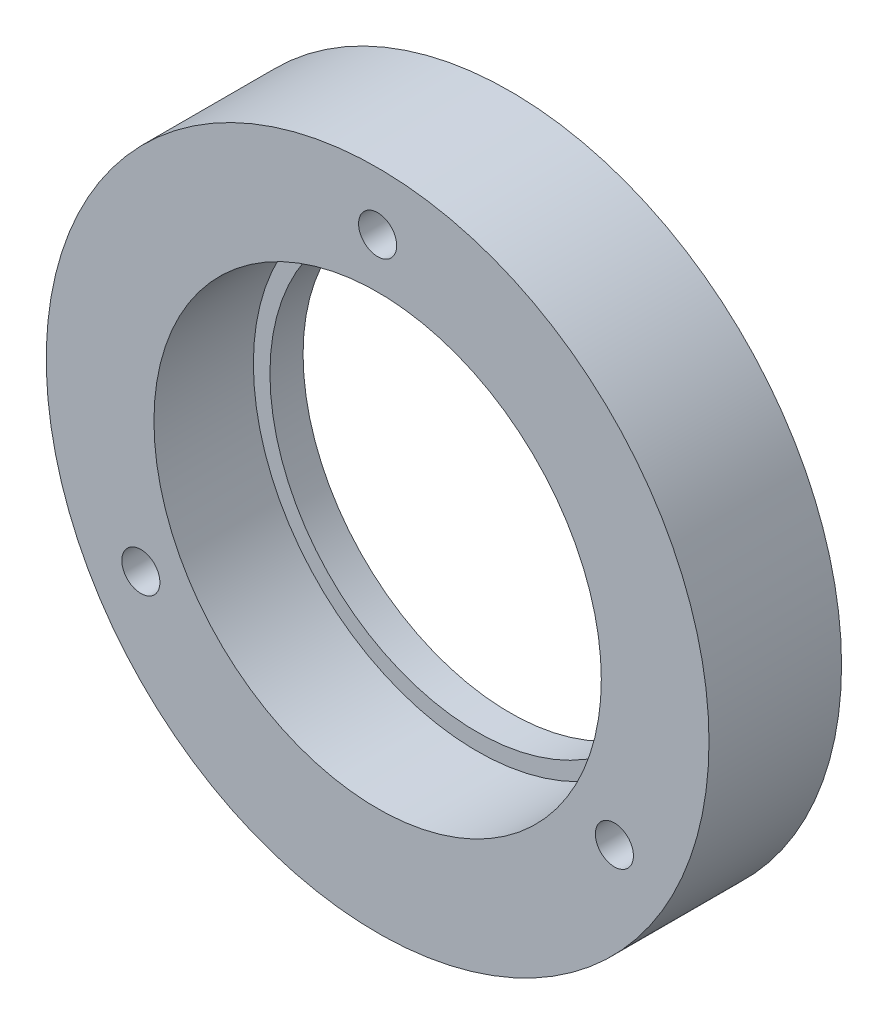
ISO-10303-21;
HEADER;
FILE_DESCRIPTION(('STEP AP214'),'2;1');
FILE_NAME('part.step','',(''),(''),'','','');
FILE_SCHEMA(('AUTOMOTIVE_DESIGN { 1 0 10303 214 1 1 1 1 }'));
ENDSEC;
DATA;
#1=APPLICATION_CONTEXT('core data for automotive mechanical design processes');
#2=APPLICATION_PROTOCOL_DEFINITION('international standard','automotive_design',2000,#1);
#3=PRODUCT_CONTEXT('',#1,'mechanical');
#4=PRODUCT('Part','Part','',(#3));
#5=PRODUCT_RELATED_PRODUCT_CATEGORY('part','',(#4));
#6=PRODUCT_DEFINITION_FORMATION('','',#4);
#7=PRODUCT_DEFINITION_CONTEXT('part definition',#1,'design');
#8=PRODUCT_DEFINITION('design','',#6,#7);
#9=PRODUCT_DEFINITION_SHAPE('','',#8);
#10=(LENGTH_UNIT() NAMED_UNIT(*) SI_UNIT(.MILLI.,.METRE.));
#11=(NAMED_UNIT(*) PLANE_ANGLE_UNIT() SI_UNIT($,.RADIAN.));
#12=(NAMED_UNIT(*) SI_UNIT($,.STERADIAN.) SOLID_ANGLE_UNIT());
#13=UNCERTAINTY_MEASURE_WITH_UNIT(LENGTH_MEASURE(1.E-05),#10,'distance_accuracy_value','');
#14=(GEOMETRIC_REPRESENTATION_CONTEXT(3) GLOBAL_UNCERTAINTY_ASSIGNED_CONTEXT((#13)) GLOBAL_UNIT_ASSIGNED_CONTEXT((#10,
#11,#12)) REPRESENTATION_CONTEXT('',''));
#15=CARTESIAN_POINT('',(0.,0.,0.));
#16=DIRECTION('',(0.,0.,1.));
#17=DIRECTION('',(1.,0.,0.));
#18=AXIS2_PLACEMENT_3D('',#15,#16,#17);
#19=CARTESIAN_POINT('',(14.2894191624433,-8.24999999999986,8.));
#20=DIRECTION('',(0.,0.,-1.));
#21=DIRECTION('',(-1.,0.,0.));
#22=AXIS2_PLACEMENT_3D('',#19,#20,#21);
#23=CYLINDRICAL_SURFACE('',#22,1.15);
#24=CARTESIAN_POINT('',(14.2894191624433,-8.24999999999986,8.));
#25=DIRECTION('',(0.,0.,-1.));
#26=DIRECTION('',(-1.,0.,0.));
#27=AXIS2_PLACEMENT_3D('',#24,#25,#26);
#28=CIRCLE('',#27,1.15);
#29=CARTESIAN_POINT('',(13.1394191624433,-8.24999999999986,8.));
#30=VERTEX_POINT('',#29);
#31=EDGE_CURVE('E321',#30,#30,#28,.T.);
#32=ORIENTED_EDGE('',*,*,#31,.F.);
#33=EDGE_LOOP('',(#32));
#34=FACE_BOUND('',#33,.T.);
#35=CARTESIAN_POINT('',(14.2894191624433,-8.24999999999986,3.5));
#36=DIRECTION('',(0.,0.,-1.));
#37=DIRECTION('',(-1.,0.,0.));
#38=AXIS2_PLACEMENT_3D('',#35,#36,#37);
#39=CIRCLE('',#38,1.15);
#40=CARTESIAN_POINT('',(13.1394191624433,-8.24999999999986,3.5));
#41=VERTEX_POINT('',#40);
#42=EDGE_CURVE('E43',#41,#41,#39,.F.);
#43=ORIENTED_EDGE('',*,*,#42,.F.);
#44=EDGE_LOOP('',(#43));
#45=FACE_BOUND('',#44,.T.);
#46=ADVANCED_FACE('F39',(#34,#45),#23,.F.);
#47=CARTESIAN_POINT('',(-14.2894191624432,-8.25000000000007,8.));
#48=DIRECTION('',(0.,0.,-1.));
#49=DIRECTION('',(-1.,0.,0.));
#50=AXIS2_PLACEMENT_3D('',#47,#48,#49);
#51=CYLINDRICAL_SURFACE('',#50,1.15);
#52=CARTESIAN_POINT('',(-14.2894191624432,-8.25000000000007,8.));
#53=DIRECTION('',(0.,0.,-1.));
#54=DIRECTION('',(-1.,0.,0.));
#55=AXIS2_PLACEMENT_3D('',#52,#53,#54);
#56=CIRCLE('',#55,1.15);
#57=CARTESIAN_POINT('',(-15.4394191624432,-8.25000000000007,8.));
#58=VERTEX_POINT('',#57);
#59=EDGE_CURVE('E322',#58,#58,#56,.T.);
#60=ORIENTED_EDGE('',*,*,#59,.F.);
#61=EDGE_LOOP('',(#60));
#62=FACE_BOUND('',#61,.T.);
#63=CARTESIAN_POINT('',(-14.2894191624432,-8.25000000000007,3.5));
#64=DIRECTION('',(0.,0.,-1.));
#65=DIRECTION('',(-1.,0.,0.));
#66=AXIS2_PLACEMENT_3D('',#63,#64,#65);
#67=CIRCLE('',#66,1.15);
#68=CARTESIAN_POINT('',(-15.4394191624432,-8.25000000000007,3.5));
#69=VERTEX_POINT('',#68);
#70=EDGE_CURVE('E213',#69,#69,#67,.F.);
#71=ORIENTED_EDGE('',*,*,#70,.F.);
#72=EDGE_LOOP('',(#71));
#73=FACE_BOUND('',#72,.T.);
#74=ADVANCED_FACE('F346',(#62,#73),#51,.F.);
#75=CARTESIAN_POINT('',(0.,16.5,8.));
#76=DIRECTION('',(0.,0.,-1.));
#77=DIRECTION('',(-1.,0.,0.));
#78=AXIS2_PLACEMENT_3D('',#75,#76,#77);
#79=CYLINDRICAL_SURFACE('',#78,1.15);
#80=CARTESIAN_POINT('',(0.,16.5,8.));
#81=DIRECTION('',(0.,0.,-1.));
#82=DIRECTION('',(-1.,0.,0.));
#83=AXIS2_PLACEMENT_3D('',#80,#81,#82);
#84=CIRCLE('',#83,1.15);
#85=CARTESIAN_POINT('',(-1.15,16.5,8.));
#86=VERTEX_POINT('',#85);
#87=EDGE_CURVE('E320',#86,#86,#84,.T.);
#88=ORIENTED_EDGE('',*,*,#87,.F.);
#89=EDGE_LOOP('',(#88));
#90=FACE_BOUND('',#89,.T.);
#91=CARTESIAN_POINT('',(0.,16.5,3.5));
#92=DIRECTION('',(0.,0.,-1.));
#93=DIRECTION('',(-1.,0.,0.));
#94=AXIS2_PLACEMENT_3D('',#91,#92,#93);
#95=CIRCLE('',#94,1.15);
#96=CARTESIAN_POINT('',(-1.15,16.5,3.5));
#97=VERTEX_POINT('',#96);
#98=EDGE_CURVE('E306',#97,#97,#95,.F.);
#99=ORIENTED_EDGE('',*,*,#98,.F.);
#100=EDGE_LOOP('',(#99));
#101=FACE_BOUND('',#100,.T.);
#102=ADVANCED_FACE('F354',(#90,#101),#79,.F.);
#103=CARTESIAN_POINT('',(0.,0.,8.));
#104=DIRECTION('',(0.,0.,-1.));
#105=DIRECTION('',(-1.,0.,0.));
#106=AXIS2_PLACEMENT_3D('',#103,#104,#105);
#107=CYLINDRICAL_SURFACE('',#106,13.5);
#108=CARTESIAN_POINT('',(0.,0.,8.));
#109=DIRECTION('',(0.,0.,1.));
#110=DIRECTION('',(1.,0.,0.));
#111=AXIS2_PLACEMENT_3D('',#108,#109,#110);
#112=CIRCLE('',#111,13.5);
#113=CARTESIAN_POINT('',(13.5,0.,8.));
#114=VERTEX_POINT('',#113);
#115=EDGE_CURVE('E331',#114,#114,#112,.T.);
#116=ORIENTED_EDGE('',*,*,#115,.T.);
#117=EDGE_LOOP('',(#116));
#118=FACE_BOUND('',#117,.T.);
#119=CARTESIAN_POINT('',(0.,0.,2.));
#120=DIRECTION('',(0.,0.,-1.));
#121=DIRECTION('',(-1.,0.,0.));
#122=AXIS2_PLACEMENT_3D('',#119,#120,#121);
#123=CIRCLE('',#122,13.5);
#124=CARTESIAN_POINT('',(-13.5,0.,2.));
#125=VERTEX_POINT('',#124);
#126=EDGE_CURVE('E327',#125,#125,#123,.T.);
#127=ORIENTED_EDGE('',*,*,#126,.T.);
#128=EDGE_LOOP('',(#127));
#129=FACE_BOUND('',#128,.T.);
#130=ADVANCED_FACE('F369',(#118,#129),#107,.F.);
#131=CARTESIAN_POINT('',(0.,0.,8.));
#132=DIRECTION('',(0.,0.,1.));
#133=DIRECTION('',(1.,0.,0.));
#134=AXIS2_PLACEMENT_3D('',#131,#132,#133);
#135=PLANE('',#134);
#136=ORIENTED_EDGE('',*,*,#87,.T.);
#137=EDGE_LOOP('',(#136));
#138=FACE_BOUND('',#137,.T.);
#139=ORIENTED_EDGE('',*,*,#59,.T.);
#140=EDGE_LOOP('',(#139));
#141=FACE_BOUND('',#140,.T.);
#142=ORIENTED_EDGE('',*,*,#31,.T.);
#143=EDGE_LOOP('',(#142));
#144=FACE_BOUND('',#143,.T.);
#145=CARTESIAN_POINT('',(0.,0.,8.));
#146=DIRECTION('',(0.,0.,1.));
#147=DIRECTION('',(1.,0.,0.));
#148=AXIS2_PLACEMENT_3D('',#145,#146,#147);
#149=CIRCLE('',#148,20.);
#150=CARTESIAN_POINT('',(20.,0.,8.));
#151=VERTEX_POINT('',#150);
#152=EDGE_CURVE('E11',#151,#151,#149,.T.);
#153=ORIENTED_EDGE('',*,*,#152,.T.);
#154=EDGE_LOOP('',(#153));
#155=FACE_BOUND('',#154,.T.);
#156=ORIENTED_EDGE('',*,*,#115,.F.);
#157=EDGE_LOOP('',(#156));
#158=FACE_BOUND('',#157,.T.);
#159=ADVANCED_FACE('F373',(#138,#141,#144,#155,#158),#135,.T.);
#160=CARTESIAN_POINT('',(0.,0.,0.));
#161=DIRECTION('',(0.,0.,1.));
#162=DIRECTION('',(1.,0.,0.));
#163=AXIS2_PLACEMENT_3D('',#160,#161,#162);
#164=PLANE('',#163);
#165=DIRECTION('',(0.866025403784441,0.499999999999996,0.));
#166=VECTOR('',#165,1.);
#167=CARTESIAN_POINT('',(12.2394191624432,-7.06643194816133,0.));
#168=LINE('',#167,#166);
#169=CARTESIAN_POINT('',(12.2394191624432,-7.06643194816133,0.));
#170=VERTEX_POINT('',#169);
#171=CARTESIAN_POINT('',(14.2894191624432,-5.8828638963226,0.));
#172=VERTEX_POINT('',#171);
#173=EDGE_CURVE('E205',#170,#172,#168,.T.);
#174=ORIENTED_EDGE('',*,*,#173,.F.);
#175=DIRECTION('',(0.,1.,0.));
#176=VECTOR('',#175,1.);
#177=CARTESIAN_POINT('',(12.2394191624432,-9.43356805183879,0.));
#178=LINE('',#177,#176);
#179=CARTESIAN_POINT('',(12.2394191624432,-9.43356805183879,0.));
#180=VERTEX_POINT('',#179);
#181=EDGE_CURVE('E57',#180,#170,#178,.T.);
#182=ORIENTED_EDGE('',*,*,#181,.F.);
#183=DIRECTION('',(-0.866025403784436,0.500000000000004,0.));
#184=VECTOR('',#183,1.);
#185=CARTESIAN_POINT('',(14.2894191624432,-10.6171361036775,0.));
#186=LINE('',#185,#184);
#187=CARTESIAN_POINT('',(14.2894191624432,-10.6171361036775,0.));
#188=VERTEX_POINT('',#187);
#189=EDGE_CURVE('E189',#188,#180,#186,.T.);
#190=ORIENTED_EDGE('',*,*,#189,.F.);
#191=DIRECTION('',(-0.866025403784441,-0.499999999999996,0.));
#192=VECTOR('',#191,1.);
#193=CARTESIAN_POINT('',(16.3394191624432,-9.43356805183882,0.));
#194=LINE('',#193,#192);
#195=CARTESIAN_POINT('',(16.3394191624432,-9.43356805183882,0.));
#196=VERTEX_POINT('',#195);
#197=EDGE_CURVE('E192',#196,#188,#194,.T.);
#198=ORIENTED_EDGE('',*,*,#197,.F.);
#199=DIRECTION('',(0.,-1.,0.));
#200=VECTOR('',#199,1.);
#201=CARTESIAN_POINT('',(16.3394191624432,-7.06643194816135,0.));
#202=LINE('',#201,#200);
#203=CARTESIAN_POINT('',(16.3394191624432,-7.06643194816135,0.));
#204=VERTEX_POINT('',#203);
#205=EDGE_CURVE('E206',#204,#196,#202,.T.);
#206=ORIENTED_EDGE('',*,*,#205,.F.);
#207=DIRECTION('',(0.866025403784436,-0.500000000000004,0.));
#208=VECTOR('',#207,1.);
#209=CARTESIAN_POINT('',(14.2894191624432,-5.8828638963226,0.));
#210=LINE('',#209,#208);
#211=EDGE_CURVE('E204',#172,#204,#210,.T.);
#212=ORIENTED_EDGE('',*,*,#211,.F.);
#213=EDGE_LOOP('',(#174,#182,#190,#198,#206,#212));
#214=FACE_BOUND('',#213,.T.);
#215=DIRECTION('',(0.,-1.,0.));
#216=VECTOR('',#215,1.);
#217=CARTESIAN_POINT('',(-12.2394191624433,-7.06643194816115,0.));
#218=LINE('',#217,#216);
#219=CARTESIAN_POINT('',(-12.2394191624433,-7.06643194816115,0.));
#220=VERTEX_POINT('',#219);
#221=CARTESIAN_POINT('',(-12.2394191624433,-9.43356805183862,0.));
#222=VERTEX_POINT('',#221);
#223=EDGE_CURVE('E242',#220,#222,#218,.T.);
#224=ORIENTED_EDGE('',*,*,#223,.F.);
#225=DIRECTION('',(0.866025403784434,-0.500000000000008,0.));
#226=VECTOR('',#225,1.);
#227=CARTESIAN_POINT('',(-14.2894191624433,-5.8828638963224,0.));
#228=LINE('',#227,#226);
#229=CARTESIAN_POINT('',(-14.2894191624433,-5.8828638963224,0.));
#230=VERTEX_POINT('',#229);
#231=EDGE_CURVE('E61',#230,#220,#228,.T.);
#232=ORIENTED_EDGE('',*,*,#231,.F.);
#233=DIRECTION('',(0.866025403784443,0.499999999999992,0.));
#234=VECTOR('',#233,1.);
#235=CARTESIAN_POINT('',(-16.3394191624433,-7.06643194816112,0.));
#236=LINE('',#235,#234);
#237=CARTESIAN_POINT('',(-16.3394191624433,-7.06643194816112,0.));
#238=VERTEX_POINT('',#237);
#239=EDGE_CURVE('E227',#238,#230,#236,.T.);
#240=ORIENTED_EDGE('',*,*,#239,.F.);
#241=DIRECTION('',(0.,1.,0.));
#242=VECTOR('',#241,1.);
#243=CARTESIAN_POINT('',(-16.3394191624433,-9.43356805183858,0.));
#244=LINE('',#243,#242);
#245=CARTESIAN_POINT('',(-16.3394191624433,-9.43356805183858,0.));
#246=VERTEX_POINT('',#245);
#247=EDGE_CURVE('E254',#246,#238,#244,.T.);
#248=ORIENTED_EDGE('',*,*,#247,.F.);
#249=DIRECTION('',(-0.866025403784434,0.500000000000008,0.));
#250=VECTOR('',#249,1.);
#251=CARTESIAN_POINT('',(-14.2894191624433,-10.6171361036773,0.));
#252=LINE('',#251,#250);
#253=CARTESIAN_POINT('',(-14.2894191624433,-10.6171361036773,0.));
#254=VERTEX_POINT('',#253);
#255=EDGE_CURVE('E249',#254,#246,#252,.T.);
#256=ORIENTED_EDGE('',*,*,#255,.F.);
#257=DIRECTION('',(-0.866025403784443,-0.499999999999992,0.));
#258=VECTOR('',#257,1.);
#259=CARTESIAN_POINT('',(-12.2394191624433,-9.43356805183862,0.));
#260=LINE('',#259,#258);
#261=EDGE_CURVE('E250',#222,#254,#260,.T.);
#262=ORIENTED_EDGE('',*,*,#261,.F.);
#263=EDGE_LOOP('',(#224,#232,#240,#248,#256,#262));
#264=FACE_BOUND('',#263,.T.);
#265=DIRECTION('',(-0.866025403784438,0.5,0.));
#266=VECTOR('',#265,1.);
#267=CARTESIAN_POINT('',(0.,14.1328638963225,0.));
#268=LINE('',#267,#266);
#269=CARTESIAN_POINT('',(0.,14.1328638963225,0.));
#270=VERTEX_POINT('',#269);
#271=CARTESIAN_POINT('',(-2.05,15.3164319481613,0.));
#272=VERTEX_POINT('',#271);
#273=EDGE_CURVE('E289',#270,#272,#268,.T.);
#274=ORIENTED_EDGE('',*,*,#273,.F.);
#275=DIRECTION('',(-0.866025403784439,-0.5,0.));
#276=VECTOR('',#275,1.);
#277=CARTESIAN_POINT('',(2.05,15.3164319481613,0.));
#278=LINE('',#277,#276);
#279=CARTESIAN_POINT('',(2.05,15.3164319481613,0.));
#280=VERTEX_POINT('',#279);
#281=EDGE_CURVE('E286',#280,#270,#278,.T.);
#282=ORIENTED_EDGE('',*,*,#281,.F.);
#283=DIRECTION('',(0.,-1.,0.));
#284=VECTOR('',#283,1.);
#285=CARTESIAN_POINT('',(2.05,17.6835680518387,0.));
#286=LINE('',#285,#284);
#287=CARTESIAN_POINT('',(2.05,17.6835680518387,0.));
#288=VERTEX_POINT('',#287);
#289=EDGE_CURVE('E275',#288,#280,#286,.T.);
#290=ORIENTED_EDGE('',*,*,#289,.F.);
#291=DIRECTION('',(0.866025403784439,-0.5,0.));
#292=VECTOR('',#291,1.);
#293=CARTESIAN_POINT('',(0.,18.8671361036775,0.));
#294=LINE('',#293,#292);
#295=CARTESIAN_POINT('',(0.,18.8671361036775,0.));
#296=VERTEX_POINT('',#295);
#297=EDGE_CURVE('E299',#296,#288,#294,.T.);
#298=ORIENTED_EDGE('',*,*,#297,.F.);
#299=DIRECTION('',(0.866025403784439,0.5,0.));
#300=VECTOR('',#299,1.);
#301=CARTESIAN_POINT('',(-2.05,17.6835680518387,0.));
#302=LINE('',#301,#300);
#303=CARTESIAN_POINT('',(-2.05,17.6835680518387,0.));
#304=VERTEX_POINT('',#303);
#305=EDGE_CURVE('E298',#304,#296,#302,.T.);
#306=ORIENTED_EDGE('',*,*,#305,.F.);
#307=DIRECTION('',(0.,1.,0.));
#308=VECTOR('',#307,1.);
#309=CARTESIAN_POINT('',(-2.05,15.3164319481613,0.));
#310=LINE('',#309,#308);
#311=EDGE_CURVE('E291',#272,#304,#310,.T.);
#312=ORIENTED_EDGE('',*,*,#311,.F.);
#313=EDGE_LOOP('',(#274,#282,#290,#298,#306,#312));
#314=FACE_BOUND('',#313,.T.);
#315=CARTESIAN_POINT('',(0.,0.,0.));
#316=DIRECTION('',(0.,0.,1.));
#317=DIRECTION('',(1.,0.,0.));
#318=AXIS2_PLACEMENT_3D('',#315,#316,#317);
#319=CIRCLE('',#318,20.);
#320=CARTESIAN_POINT('',(20.,0.,0.));
#321=VERTEX_POINT('',#320);
#322=EDGE_CURVE('E48',#321,#321,#319,.T.);
#323=ORIENTED_EDGE('',*,*,#322,.F.);
#324=EDGE_LOOP('',(#323));
#325=FACE_BOUND('',#324,.T.);
#326=CARTESIAN_POINT('',(0.,0.,0.));
#327=DIRECTION('',(0.,0.,-1.));
#328=DIRECTION('',(-1.,0.,0.));
#329=AXIS2_PLACEMENT_3D('',#326,#327,#328);
#330=CIRCLE('',#329,12.5);
#331=CARTESIAN_POINT('',(-12.5,0.,0.));
#332=VERTEX_POINT('',#331);
#333=EDGE_CURVE('E318',#332,#332,#330,.T.);
#334=ORIENTED_EDGE('',*,*,#333,.F.);
#335=EDGE_LOOP('',(#334));
#336=FACE_BOUND('',#335,.T.);
#337=ADVANCED_FACE('F376',(#214,#264,#314,#325,#336),#164,.F.);
#338=CARTESIAN_POINT('',(0.,0.,8.));
#339=DIRECTION('',(0.,0.,-1.));
#340=DIRECTION('',(-1.,0.,0.));
#341=AXIS2_PLACEMENT_3D('',#338,#339,#340);
#342=CYLINDRICAL_SURFACE('',#341,20.);
#343=ORIENTED_EDGE('',*,*,#322,.T.);
#344=EDGE_LOOP('',(#343));
#345=FACE_BOUND('',#344,.T.);
#346=ORIENTED_EDGE('',*,*,#152,.F.);
#347=EDGE_LOOP('',(#346));
#348=FACE_BOUND('',#347,.T.);
#349=ADVANCED_FACE('F41',(#345,#348),#342,.T.);
#350=CARTESIAN_POINT('',(0.,0.,2.));
#351=DIRECTION('',(0.,0.,-1.));
#352=DIRECTION('',(-1.,0.,0.));
#353=AXIS2_PLACEMENT_3D('',#350,#351,#352);
#354=PLANE('',#353);
#355=CARTESIAN_POINT('',(0.,0.,2.));
#356=DIRECTION('',(0.,0.,-1.));
#357=DIRECTION('',(-1.,0.,0.));
#358=AXIS2_PLACEMENT_3D('',#355,#356,#357);
#359=CIRCLE('',#358,12.5);
#360=CARTESIAN_POINT('',(-12.5,0.,2.));
#361=VERTEX_POINT('',#360);
#362=EDGE_CURVE('E330',#361,#361,#359,.T.);
#363=ORIENTED_EDGE('',*,*,#362,.T.);
#364=EDGE_LOOP('',(#363));
#365=FACE_BOUND('',#364,.T.);
#366=ORIENTED_EDGE('',*,*,#126,.F.);
#367=EDGE_LOOP('',(#366));
#368=FACE_BOUND('',#367,.T.);
#369=ADVANCED_FACE('F362',(#365,#368),#354,.F.);
#370=CARTESIAN_POINT('',(0.,0.,2.));
#371=DIRECTION('',(0.,0.,-1.));
#372=DIRECTION('',(-1.,0.,0.));
#373=AXIS2_PLACEMENT_3D('',#370,#371,#372);
#374=CYLINDRICAL_SURFACE('',#373,12.5);
#375=ORIENTED_EDGE('',*,*,#362,.F.);
#376=EDGE_LOOP('',(#375));
#377=FACE_BOUND('',#376,.T.);
#378=ORIENTED_EDGE('',*,*,#333,.T.);
#379=EDGE_LOOP('',(#378));
#380=FACE_BOUND('',#379,.T.);
#381=ADVANCED_FACE('F363',(#377,#380),#374,.F.);
#382=CARTESIAN_POINT('',(0.,0.,3.5));
#383=DIRECTION('',(0.,0.,-1.));
#384=DIRECTION('',(-1.,0.,0.));
#385=AXIS2_PLACEMENT_3D('',#382,#383,#384);
#386=PLANE('',#385);
#387=DIRECTION('',(-0.866025403784439,-0.5,0.));
#388=VECTOR('',#387,1.);
#389=CARTESIAN_POINT('',(2.05,15.3164319481613,3.5));
#390=LINE('',#389,#388);
#391=CARTESIAN_POINT('',(2.05,15.3164319481613,3.5));
#392=VERTEX_POINT('',#391);
#393=CARTESIAN_POINT('',(0.,14.1328638963225,3.5));
#394=VERTEX_POINT('',#393);
#395=EDGE_CURVE('E266',#392,#394,#390,.T.);
#396=ORIENTED_EDGE('',*,*,#395,.T.);
#397=DIRECTION('',(-0.866025403784438,0.5,0.));
#398=VECTOR('',#397,1.);
#399=CARTESIAN_POINT('',(0.,14.1328638963225,3.5));
#400=LINE('',#399,#398);
#401=CARTESIAN_POINT('',(-2.05,15.3164319481613,3.5));
#402=VERTEX_POINT('',#401);
#403=EDGE_CURVE('E272',#394,#402,#400,.T.);
#404=ORIENTED_EDGE('',*,*,#403,.T.);
#405=DIRECTION('',(0.,1.,0.));
#406=VECTOR('',#405,1.);
#407=CARTESIAN_POINT('',(-2.05,15.3164319481613,3.5));
#408=LINE('',#407,#406);
#409=CARTESIAN_POINT('',(-2.05,17.6835680518387,3.5));
#410=VERTEX_POINT('',#409);
#411=EDGE_CURVE('E273',#402,#410,#408,.T.);
#412=ORIENTED_EDGE('',*,*,#411,.T.);
#413=DIRECTION('',(0.866025403784439,0.5,0.));
#414=VECTOR('',#413,1.);
#415=CARTESIAN_POINT('',(-2.05,17.6835680518387,3.5));
#416=LINE('',#415,#414);
#417=CARTESIAN_POINT('',(0.,18.8671361036775,3.5));
#418=VERTEX_POINT('',#417);
#419=EDGE_CURVE('E279',#410,#418,#416,.T.);
#420=ORIENTED_EDGE('',*,*,#419,.T.);
#421=DIRECTION('',(0.866025403784439,-0.5,0.));
#422=VECTOR('',#421,1.);
#423=CARTESIAN_POINT('',(0.,18.8671361036775,3.5));
#424=LINE('',#423,#422);
#425=CARTESIAN_POINT('',(2.05,17.6835680518387,3.5));
#426=VERTEX_POINT('',#425);
#427=EDGE_CURVE('E283',#418,#426,#424,.T.);
#428=ORIENTED_EDGE('',*,*,#427,.T.);
#429=DIRECTION('',(0.,-1.,0.));
#430=VECTOR('',#429,1.);
#431=CARTESIAN_POINT('',(2.05,17.6835680518387,3.5));
#432=LINE('',#431,#430);
#433=EDGE_CURVE('E284',#426,#392,#432,.T.);
#434=ORIENTED_EDGE('',*,*,#433,.T.);
#435=EDGE_LOOP('',(#396,#404,#412,#420,#428,#434));
#436=FACE_BOUND('',#435,.T.);
#437=ORIENTED_EDGE('',*,*,#98,.T.);
#438=EDGE_LOOP('',(#437));
#439=FACE_BOUND('',#438,.T.);
#440=ADVANCED_FACE('F364',(#436,#439),#386,.T.);
#441=CARTESIAN_POINT('',(2.05,15.3164319481613,3.5));
#442=DIRECTION('',(0.5,-0.866025403784438,0.));
#443=DIRECTION('',(0.866025403784439,0.5,0.));
#444=AXIS2_PLACEMENT_3D('',#441,#442,#443);
#445=PLANE('',#444);
#446=ORIENTED_EDGE('',*,*,#281,.T.);
#447=DIRECTION('',(0.,0.,-1.));
#448=VECTOR('',#447,1.);
#449=CARTESIAN_POINT('',(0.,14.1328638963225,3.5));
#450=LINE('',#449,#448);
#451=EDGE_CURVE('E290',#394,#270,#450,.T.);
#452=ORIENTED_EDGE('',*,*,#451,.F.);
#453=ORIENTED_EDGE('',*,*,#395,.F.);
#454=DIRECTION('',(0.,0.,-1.));
#455=VECTOR('',#454,1.);
#456=CARTESIAN_POINT('',(2.05,15.3164319481613,3.5));
#457=LINE('',#456,#455);
#458=EDGE_CURVE('E302',#392,#280,#457,.T.);
#459=ORIENTED_EDGE('',*,*,#458,.T.);
#460=EDGE_LOOP('',(#446,#452,#453,#459));
#461=FACE_BOUND('',#460,.T.);
#462=ADVANCED_FACE('F414',(#461),#445,.F.);
#463=CARTESIAN_POINT('',(2.05,17.6835680518387,3.5));
#464=DIRECTION('',(1.,0.,0.));
#465=DIRECTION('',(0.,1.,0.));
#466=AXIS2_PLACEMENT_3D('',#463,#464,#465);
#467=PLANE('',#466);
#468=ORIENTED_EDGE('',*,*,#289,.T.);
#469=ORIENTED_EDGE('',*,*,#458,.F.);
#470=ORIENTED_EDGE('',*,*,#433,.F.);
#471=DIRECTION('',(0.,0.,-1.));
#472=VECTOR('',#471,1.);
#473=CARTESIAN_POINT('',(2.05,17.6835680518387,3.5));
#474=LINE('',#473,#472);
#475=EDGE_CURVE('E310',#426,#288,#474,.T.);
#476=ORIENTED_EDGE('',*,*,#475,.T.);
#477=EDGE_LOOP('',(#468,#469,#470,#476));
#478=FACE_BOUND('',#477,.T.);
#479=ADVANCED_FACE('F420',(#478),#467,.F.);
#480=CARTESIAN_POINT('',(0.,18.8671361036775,3.5));
#481=DIRECTION('',(0.5,0.866025403784438,0.));
#482=DIRECTION('',(-0.866025403784439,0.5,0.));
#483=AXIS2_PLACEMENT_3D('',#480,#481,#482);
#484=PLANE('',#483);
#485=ORIENTED_EDGE('',*,*,#297,.T.);
#486=ORIENTED_EDGE('',*,*,#475,.F.);
#487=ORIENTED_EDGE('',*,*,#427,.F.);
#488=DIRECTION('',(0.,0.,-1.));
#489=VECTOR('',#488,1.);
#490=CARTESIAN_POINT('',(0.,18.8671361036775,3.5));
#491=LINE('',#490,#489);
#492=EDGE_CURVE('E307',#418,#296,#491,.T.);
#493=ORIENTED_EDGE('',*,*,#492,.T.);
#494=EDGE_LOOP('',(#485,#486,#487,#493));
#495=FACE_BOUND('',#494,.T.);
#496=ADVANCED_FACE('F419',(#495),#484,.F.);
#497=CARTESIAN_POINT('',(-2.05,17.6835680518387,3.5));
#498=DIRECTION('',(-0.5,0.866025403784439,0.));
#499=DIRECTION('',(-0.866025403784439,-0.5,0.));
#500=AXIS2_PLACEMENT_3D('',#497,#498,#499);
#501=PLANE('',#500);
#502=ORIENTED_EDGE('',*,*,#305,.T.);
#503=ORIENTED_EDGE('',*,*,#492,.F.);
#504=ORIENTED_EDGE('',*,*,#419,.F.);
#505=DIRECTION('',(0.,0.,-1.));
#506=VECTOR('',#505,1.);
#507=CARTESIAN_POINT('',(-2.05,17.6835680518387,3.5));
#508=LINE('',#507,#506);
#509=EDGE_CURVE('E311',#410,#304,#508,.T.);
#510=ORIENTED_EDGE('',*,*,#509,.T.);
#511=EDGE_LOOP('',(#502,#503,#504,#510));
#512=FACE_BOUND('',#511,.T.);
#513=ADVANCED_FACE('F425',(#512),#501,.F.);
#514=CARTESIAN_POINT('',(-2.05,15.3164319481613,3.5));
#515=DIRECTION('',(-1.,0.,0.));
#516=DIRECTION('',(0.,0.,1.));
#517=AXIS2_PLACEMENT_3D('',#514,#515,#516);
#518=PLANE('',#517);
#519=ORIENTED_EDGE('',*,*,#311,.T.);
#520=ORIENTED_EDGE('',*,*,#509,.F.);
#521=ORIENTED_EDGE('',*,*,#411,.F.);
#522=DIRECTION('',(0.,0.,-1.));
#523=VECTOR('',#522,1.);
#524=CARTESIAN_POINT('',(-2.05,15.3164319481613,3.5));
#525=LINE('',#524,#523);
#526=EDGE_CURVE('E312',#402,#272,#525,.T.);
#527=ORIENTED_EDGE('',*,*,#526,.T.);
#528=EDGE_LOOP('',(#519,#520,#521,#527));
#529=FACE_BOUND('',#528,.T.);
#530=ADVANCED_FACE('F428',(#529),#518,.F.);
#531=CARTESIAN_POINT('',(0.,14.1328638963225,3.5));
#532=DIRECTION('',(-0.5,-0.866025403784438,0.));
#533=DIRECTION('',(0.866025403784438,-0.5,0.));
#534=AXIS2_PLACEMENT_3D('',#531,#532,#533);
#535=PLANE('',#534);
#536=ORIENTED_EDGE('',*,*,#273,.T.);
#537=ORIENTED_EDGE('',*,*,#526,.F.);
#538=ORIENTED_EDGE('',*,*,#403,.F.);
#539=ORIENTED_EDGE('',*,*,#451,.T.);
#540=EDGE_LOOP('',(#536,#537,#538,#539));
#541=FACE_BOUND('',#540,.T.);
#542=ADVANCED_FACE('F406',(#541),#535,.F.);
#543=CARTESIAN_POINT('',(0.,0.,3.5));
#544=DIRECTION('',(0.,0.,-1.));
#545=DIRECTION('',(0.499999999999992,-0.866025403784443,0.));
#546=AXIS2_PLACEMENT_3D('',#543,#544,#545);
#547=PLANE('',#546);
#548=DIRECTION('',(0.866025403784434,-0.500000000000008,0.));
#549=VECTOR('',#548,1.);
#550=CARTESIAN_POINT('',(-14.2894191624433,-5.8828638963224,3.5));
#551=LINE('',#550,#549);
#552=CARTESIAN_POINT('',(-14.2894191624433,-5.8828638963224,3.5));
#553=VERTEX_POINT('',#552);
#554=CARTESIAN_POINT('',(-12.2394191624433,-7.06643194816115,3.5));
#555=VERTEX_POINT('',#554);
#556=EDGE_CURVE('E221',#553,#555,#551,.T.);
#557=ORIENTED_EDGE('',*,*,#556,.T.);
#558=DIRECTION('',(0.,-1.,0.));
#559=VECTOR('',#558,1.);
#560=CARTESIAN_POINT('',(-12.2394191624433,-7.06643194816115,3.5));
#561=LINE('',#560,#559);
#562=CARTESIAN_POINT('',(-12.2394191624433,-9.43356805183862,3.5));
#563=VERTEX_POINT('',#562);
#564=EDGE_CURVE('E228',#555,#563,#561,.T.);
#565=ORIENTED_EDGE('',*,*,#564,.T.);
#566=DIRECTION('',(-0.866025403784443,-0.499999999999992,0.));
#567=VECTOR('',#566,1.);
#568=CARTESIAN_POINT('',(-12.2394191624433,-9.43356805183862,3.5));
#569=LINE('',#568,#567);
#570=CARTESIAN_POINT('',(-14.2894191624433,-10.6171361036773,3.5));
#571=VERTEX_POINT('',#570);
#572=EDGE_CURVE('E229',#563,#571,#569,.T.);
#573=ORIENTED_EDGE('',*,*,#572,.T.);
#574=DIRECTION('',(-0.866025403784434,0.500000000000008,0.));
#575=VECTOR('',#574,1.);
#576=CARTESIAN_POINT('',(-14.2894191624433,-10.6171361036773,3.5));
#577=LINE('',#576,#575);
#578=CARTESIAN_POINT('',(-16.3394191624433,-9.43356805183858,3.5));
#579=VERTEX_POINT('',#578);
#580=EDGE_CURVE('E231',#571,#579,#577,.T.);
#581=ORIENTED_EDGE('',*,*,#580,.T.);
#582=DIRECTION('',(0.,1.,0.));
#583=VECTOR('',#582,1.);
#584=CARTESIAN_POINT('',(-16.3394191624433,-9.43356805183858,3.5));
#585=LINE('',#584,#583);
#586=CARTESIAN_POINT('',(-16.3394191624433,-7.06643194816112,3.5));
#587=VERTEX_POINT('',#586);
#588=EDGE_CURVE('E236',#579,#587,#585,.T.);
#589=ORIENTED_EDGE('',*,*,#588,.T.);
#590=DIRECTION('',(0.866025403784443,0.499999999999992,0.));
#591=VECTOR('',#590,1.);
#592=CARTESIAN_POINT('',(-16.3394191624433,-7.06643194816112,3.5));
#593=LINE('',#592,#591);
#594=EDGE_CURVE('E237',#587,#553,#593,.T.);
#595=ORIENTED_EDGE('',*,*,#594,.T.);
#596=EDGE_LOOP('',(#557,#565,#573,#581,#589,#595));
#597=FACE_BOUND('',#596,.T.);
#598=ORIENTED_EDGE('',*,*,#70,.T.);
#599=EDGE_LOOP('',(#598));
#600=FACE_BOUND('',#599,.T.);
#601=ADVANCED_FACE('F445',(#597,#600),#547,.T.);
#602=CARTESIAN_POINT('',(-14.2894191624433,-5.8828638963224,3.5));
#603=DIRECTION('',(0.500000000000008,0.866025403784434,0.));
#604=DIRECTION('',(-0.866025403784434,0.500000000000008,0.));
#605=AXIS2_PLACEMENT_3D('',#602,#603,#604);
#606=PLANE('',#605);
#607=ORIENTED_EDGE('',*,*,#231,.T.);
#608=DIRECTION('',(0.,0.,-1.));
#609=VECTOR('',#608,1.);
#610=CARTESIAN_POINT('',(-12.2394191624433,-7.06643194816115,3.5));
#611=LINE('',#610,#609);
#612=EDGE_CURVE('E245',#555,#220,#611,.T.);
#613=ORIENTED_EDGE('',*,*,#612,.F.);
#614=ORIENTED_EDGE('',*,*,#556,.F.);
#615=DIRECTION('',(0.,0.,-1.));
#616=VECTOR('',#615,1.);
#617=CARTESIAN_POINT('',(-14.2894191624433,-5.8828638963224,3.5));
#618=LINE('',#617,#616);
#619=EDGE_CURVE('E201',#553,#230,#618,.T.);
#620=ORIENTED_EDGE('',*,*,#619,.T.);
#621=EDGE_LOOP('',(#607,#613,#614,#620));
#622=FACE_BOUND('',#621,.T.);
#623=ADVANCED_FACE('F452',(#622),#606,.F.);
#624=CARTESIAN_POINT('',(-16.3394191624433,-7.06643194816112,3.5));
#625=DIRECTION('',(-0.499999999999992,0.866025403784443,0.));
#626=DIRECTION('',(-0.866025403784443,-0.499999999999992,0.));
#627=AXIS2_PLACEMENT_3D('',#624,#625,#626);
#628=PLANE('',#627);
#629=ORIENTED_EDGE('',*,*,#239,.T.);
#630=ORIENTED_EDGE('',*,*,#619,.F.);
#631=ORIENTED_EDGE('',*,*,#594,.F.);
#632=DIRECTION('',(0.,0.,-1.));
#633=VECTOR('',#632,1.);
#634=CARTESIAN_POINT('',(-16.3394191624433,-7.06643194816112,3.5));
#635=LINE('',#634,#633);
#636=EDGE_CURVE('E256',#587,#238,#635,.T.);
#637=ORIENTED_EDGE('',*,*,#636,.T.);
#638=EDGE_LOOP('',(#629,#630,#631,#637));
#639=FACE_BOUND('',#638,.T.);
#640=ADVANCED_FACE('F451',(#639),#628,.F.);
#641=CARTESIAN_POINT('',(-16.3394191624433,-9.43356805183858,3.5));
#642=DIRECTION('',(-1.,0.,0.));
#643=DIRECTION('',(0.,-1.,0.));
#644=AXIS2_PLACEMENT_3D('',#641,#642,#643);
#645=PLANE('',#644);
#646=ORIENTED_EDGE('',*,*,#247,.T.);
#647=ORIENTED_EDGE('',*,*,#636,.F.);
#648=ORIENTED_EDGE('',*,*,#588,.F.);
#649=DIRECTION('',(0.,0.,-1.));
#650=VECTOR('',#649,1.);
#651=CARTESIAN_POINT('',(-16.3394191624433,-9.43356805183858,3.5));
#652=LINE('',#651,#650);
#653=EDGE_CURVE('E263',#579,#246,#652,.T.);
#654=ORIENTED_EDGE('',*,*,#653,.T.);
#655=EDGE_LOOP('',(#646,#647,#648,#654));
#656=FACE_BOUND('',#655,.T.);
#657=ADVANCED_FACE('F467',(#656),#645,.F.);
#658=CARTESIAN_POINT('',(-14.2894191624433,-10.6171361036773,3.5));
#659=DIRECTION('',(-0.500000000000008,-0.866025403784434,0.));
#660=DIRECTION('',(0.866025403784434,-0.500000000000008,0.));
#661=AXIS2_PLACEMENT_3D('',#658,#659,#660);
#662=PLANE('',#661);
#663=ORIENTED_EDGE('',*,*,#255,.T.);
#664=ORIENTED_EDGE('',*,*,#653,.F.);
#665=ORIENTED_EDGE('',*,*,#580,.F.);
#666=DIRECTION('',(0.,0.,-1.));
#667=VECTOR('',#666,1.);
#668=CARTESIAN_POINT('',(-14.2894191624433,-10.6171361036773,3.5));
#669=LINE('',#668,#667);
#670=EDGE_CURVE('E261',#571,#254,#669,.T.);
#671=ORIENTED_EDGE('',*,*,#670,.T.);
#672=EDGE_LOOP('',(#663,#664,#665,#671));
#673=FACE_BOUND('',#672,.T.);
#674=ADVANCED_FACE('F465',(#673),#662,.F.);
#675=CARTESIAN_POINT('',(-12.2394191624433,-9.43356805183862,3.5));
#676=DIRECTION('',(0.499999999999992,-0.866025403784443,0.));
#677=DIRECTION('',(0.866025403784443,0.499999999999992,0.));
#678=AXIS2_PLACEMENT_3D('',#675,#676,#677);
#679=PLANE('',#678);
#680=ORIENTED_EDGE('',*,*,#261,.T.);
#681=ORIENTED_EDGE('',*,*,#670,.F.);
#682=ORIENTED_EDGE('',*,*,#572,.F.);
#683=DIRECTION('',(0.,0.,-1.));
#684=VECTOR('',#683,1.);
#685=CARTESIAN_POINT('',(-12.2394191624433,-9.43356805183862,3.5));
#686=LINE('',#685,#684);
#687=EDGE_CURVE('E262',#563,#222,#686,.T.);
#688=ORIENTED_EDGE('',*,*,#687,.T.);
#689=EDGE_LOOP('',(#680,#681,#682,#688));
#690=FACE_BOUND('',#689,.T.);
#691=ADVANCED_FACE('F456',(#690),#679,.F.);
#692=CARTESIAN_POINT('',(-12.2394191624433,-7.06643194816115,3.5));
#693=DIRECTION('',(1.,0.,0.));
#694=DIRECTION('',(0.,1.,0.));
#695=AXIS2_PLACEMENT_3D('',#692,#693,#694);
#696=PLANE('',#695);
#697=ORIENTED_EDGE('',*,*,#223,.T.);
#698=ORIENTED_EDGE('',*,*,#687,.F.);
#699=ORIENTED_EDGE('',*,*,#564,.F.);
#700=ORIENTED_EDGE('',*,*,#612,.T.);
#701=EDGE_LOOP('',(#697,#698,#699,#700));
#702=FACE_BOUND('',#701,.T.);
#703=ADVANCED_FACE('F453',(#702),#696,.F.);
#704=CARTESIAN_POINT('',(0.,0.,3.5));
#705=DIRECTION('',(0.,0.,-1.));
#706=DIRECTION('',(0.500000000000004,0.866025403784436,0.));
#707=AXIS2_PLACEMENT_3D('',#704,#705,#706);
#708=PLANE('',#707);
#709=DIRECTION('',(0.,1.,0.));
#710=VECTOR('',#709,1.);
#711=CARTESIAN_POINT('',(12.2394191624432,-9.43356805183879,3.5));
#712=LINE('',#711,#710);
#713=CARTESIAN_POINT('',(12.2394191624432,-9.43356805183879,3.5));
#714=VERTEX_POINT('',#713);
#715=CARTESIAN_POINT('',(12.2394191624432,-7.06643194816133,3.5));
#716=VERTEX_POINT('',#715);
#717=EDGE_CURVE('E166',#714,#716,#712,.T.);
#718=ORIENTED_EDGE('',*,*,#717,.T.);
#719=DIRECTION('',(0.866025403784441,0.499999999999996,0.));
#720=VECTOR('',#719,1.);
#721=CARTESIAN_POINT('',(12.2394191624432,-7.06643194816133,3.5));
#722=LINE('',#721,#720);
#723=CARTESIAN_POINT('',(14.2894191624432,-5.8828638963226,3.5));
#724=VERTEX_POINT('',#723);
#725=EDGE_CURVE('E180',#716,#724,#722,.T.);
#726=ORIENTED_EDGE('',*,*,#725,.T.);
#727=DIRECTION('',(0.866025403784436,-0.500000000000004,0.));
#728=VECTOR('',#727,1.);
#729=CARTESIAN_POINT('',(14.2894191624432,-5.8828638963226,3.5));
#730=LINE('',#729,#728);
#731=CARTESIAN_POINT('',(16.3394191624432,-7.06643194816135,3.5));
#732=VERTEX_POINT('',#731);
#733=EDGE_CURVE('E185',#724,#732,#730,.T.);
#734=ORIENTED_EDGE('',*,*,#733,.T.);
#735=DIRECTION('',(0.,-1.,0.));
#736=VECTOR('',#735,1.);
#737=CARTESIAN_POINT('',(16.3394191624432,-7.06643194816135,3.5));
#738=LINE('',#737,#736);
#739=CARTESIAN_POINT('',(16.3394191624432,-9.43356805183882,3.5));
#740=VERTEX_POINT('',#739);
#741=EDGE_CURVE('E193',#732,#740,#738,.T.);
#742=ORIENTED_EDGE('',*,*,#741,.T.);
#743=DIRECTION('',(-0.866025403784441,-0.499999999999996,0.));
#744=VECTOR('',#743,1.);
#745=CARTESIAN_POINT('',(16.3394191624432,-9.43356805183882,3.5));
#746=LINE('',#745,#744);
#747=CARTESIAN_POINT('',(14.2894191624432,-10.6171361036775,3.5));
#748=VERTEX_POINT('',#747);
#749=EDGE_CURVE('E196',#740,#748,#746,.T.);
#750=ORIENTED_EDGE('',*,*,#749,.T.);
#751=DIRECTION('',(-0.866025403784436,0.500000000000004,0.));
#752=VECTOR('',#751,1.);
#753=CARTESIAN_POINT('',(14.2894191624432,-10.6171361036775,3.5));
#754=LINE('',#753,#752);
#755=EDGE_CURVE('E172',#748,#714,#754,.T.);
#756=ORIENTED_EDGE('',*,*,#755,.T.);
#757=EDGE_LOOP('',(#718,#726,#734,#742,#750,#756));
#758=FACE_BOUND('',#757,.T.);
#759=ORIENTED_EDGE('',*,*,#42,.T.);
#760=EDGE_LOOP('',(#759));
#761=FACE_BOUND('',#760,.T.);
#762=ADVANCED_FACE('F183',(#758,#761),#708,.T.);
#763=CARTESIAN_POINT('',(12.2394191624432,-9.43356805183879,3.5));
#764=DIRECTION('',(-1.,0.,0.));
#765=DIRECTION('',(0.,-1.,0.));
#766=AXIS2_PLACEMENT_3D('',#763,#764,#765);
#767=PLANE('',#766);
#768=ORIENTED_EDGE('',*,*,#181,.T.);
#769=DIRECTION('',(0.,0.,-1.));
#770=VECTOR('',#769,1.);
#771=CARTESIAN_POINT('',(12.2394191624432,-7.06643194816133,3.5));
#772=LINE('',#771,#770);
#773=EDGE_CURVE('E165',#716,#170,#772,.T.);
#774=ORIENTED_EDGE('',*,*,#773,.F.);
#775=ORIENTED_EDGE('',*,*,#717,.F.);
#776=DIRECTION('',(0.,0.,-1.));
#777=VECTOR('',#776,1.);
#778=CARTESIAN_POINT('',(12.2394191624432,-9.43356805183879,3.5));
#779=LINE('',#778,#777);
#780=EDGE_CURVE('E214',#714,#180,#779,.T.);
#781=ORIENTED_EDGE('',*,*,#780,.T.);
#782=EDGE_LOOP('',(#768,#774,#775,#781));
#783=FACE_BOUND('',#782,.T.);
#784=ADVANCED_FACE('F168',(#783),#767,.F.);
#785=CARTESIAN_POINT('',(14.2894191624432,-10.6171361036775,3.5));
#786=DIRECTION('',(-0.500000000000004,-0.866025403784436,0.));
#787=DIRECTION('',(0.866025403784436,-0.500000000000004,0.));
#788=AXIS2_PLACEMENT_3D('',#785,#786,#787);
#789=PLANE('',#788);
#790=ORIENTED_EDGE('',*,*,#189,.T.);
#791=ORIENTED_EDGE('',*,*,#780,.F.);
#792=ORIENTED_EDGE('',*,*,#755,.F.);
#793=DIRECTION('',(0.,0.,-1.));
#794=VECTOR('',#793,1.);
#795=CARTESIAN_POINT('',(14.2894191624432,-10.6171361036775,3.5));
#796=LINE('',#795,#794);
#797=EDGE_CURVE('E218',#748,#188,#796,.T.);
#798=ORIENTED_EDGE('',*,*,#797,.T.);
#799=EDGE_LOOP('',(#790,#791,#792,#798));
#800=FACE_BOUND('',#799,.T.);
#801=ADVANCED_FACE('F476',(#800),#789,.F.);
#802=CARTESIAN_POINT('',(16.3394191624432,-9.43356805183882,3.5));
#803=DIRECTION('',(0.499999999999996,-0.866025403784441,0.));
#804=DIRECTION('',(0.866025403784441,0.499999999999996,0.));
#805=AXIS2_PLACEMENT_3D('',#802,#803,#804);
#806=PLANE('',#805);
#807=ORIENTED_EDGE('',*,*,#197,.T.);
#808=ORIENTED_EDGE('',*,*,#797,.F.);
#809=ORIENTED_EDGE('',*,*,#749,.F.);
#810=DIRECTION('',(0.,0.,-1.));
#811=VECTOR('',#810,1.);
#812=CARTESIAN_POINT('',(16.3394191624432,-9.43356805183882,3.5));
#813=LINE('',#812,#811);
#814=EDGE_CURVE('E216',#740,#196,#813,.T.);
#815=ORIENTED_EDGE('',*,*,#814,.T.);
#816=EDGE_LOOP('',(#807,#808,#809,#815));
#817=FACE_BOUND('',#816,.T.);
#818=ADVANCED_FACE('F486',(#817),#806,.F.);
#819=CARTESIAN_POINT('',(16.3394191624432,-7.06643194816135,3.5));
#820=DIRECTION('',(1.,0.,0.));
#821=DIRECTION('',(0.,1.,0.));
#822=AXIS2_PLACEMENT_3D('',#819,#820,#821);
#823=PLANE('',#822);
#824=ORIENTED_EDGE('',*,*,#205,.T.);
#825=ORIENTED_EDGE('',*,*,#814,.F.);
#826=ORIENTED_EDGE('',*,*,#741,.F.);
#827=DIRECTION('',(0.,0.,-1.));
#828=VECTOR('',#827,1.);
#829=CARTESIAN_POINT('',(16.3394191624432,-7.06643194816135,3.5));
#830=LINE('',#829,#828);
#831=EDGE_CURVE('E217',#732,#204,#830,.T.);
#832=ORIENTED_EDGE('',*,*,#831,.T.);
#833=EDGE_LOOP('',(#824,#825,#826,#832));
#834=FACE_BOUND('',#833,.T.);
#835=ADVANCED_FACE('F482',(#834),#823,.F.);
#836=CARTESIAN_POINT('',(14.2894191624432,-5.8828638963226,3.5));
#837=DIRECTION('',(0.500000000000004,0.866025403784436,0.));
#838=DIRECTION('',(-0.866025403784436,0.500000000000004,0.));
#839=AXIS2_PLACEMENT_3D('',#836,#837,#838);
#840=PLANE('',#839);
#841=ORIENTED_EDGE('',*,*,#211,.T.);
#842=ORIENTED_EDGE('',*,*,#831,.F.);
#843=ORIENTED_EDGE('',*,*,#733,.F.);
#844=DIRECTION('',(0.,0.,-1.));
#845=VECTOR('',#844,1.);
#846=CARTESIAN_POINT('',(14.2894191624432,-5.8828638963226,3.5));
#847=LINE('',#846,#845);
#848=EDGE_CURVE('E173',#724,#172,#847,.T.);
#849=ORIENTED_EDGE('',*,*,#848,.T.);
#850=EDGE_LOOP('',(#841,#842,#843,#849));
#851=FACE_BOUND('',#850,.T.);
#852=ADVANCED_FACE('F483',(#851),#840,.F.);
#853=CARTESIAN_POINT('',(12.2394191624432,-7.06643194816133,3.5));
#854=DIRECTION('',(-0.499999999999996,0.866025403784441,0.));
#855=DIRECTION('',(-0.866025403784441,-0.499999999999996,0.));
#856=AXIS2_PLACEMENT_3D('',#853,#854,#855);
#857=PLANE('',#856);
#858=ORIENTED_EDGE('',*,*,#173,.T.);
#859=ORIENTED_EDGE('',*,*,#848,.F.);
#860=ORIENTED_EDGE('',*,*,#725,.F.);
#861=ORIENTED_EDGE('',*,*,#773,.T.);
#862=EDGE_LOOP('',(#858,#859,#860,#861));
#863=FACE_BOUND('',#862,.T.);
#864=ADVANCED_FACE('F178',(#863),#857,.F.);
#865=CLOSED_SHELL('',(#46,#74,#102,#130,#159,#337,#349,#369,#381,#440,#462,#479,#496,#513,#530,
#542,#601,#623,#640,#657,#674,#691,#703,#762,#784,#801,#818,#835,#852,#864));
#866=MANIFOLD_SOLID_BREP('B2',#865);
#867=ADVANCED_BREP_SHAPE_REPRESENTATION('',(#18,#866),#14);
#868=SHAPE_DEFINITION_REPRESENTATION(#9,#867);
ENDSEC;
END-ISO-10303-21;
